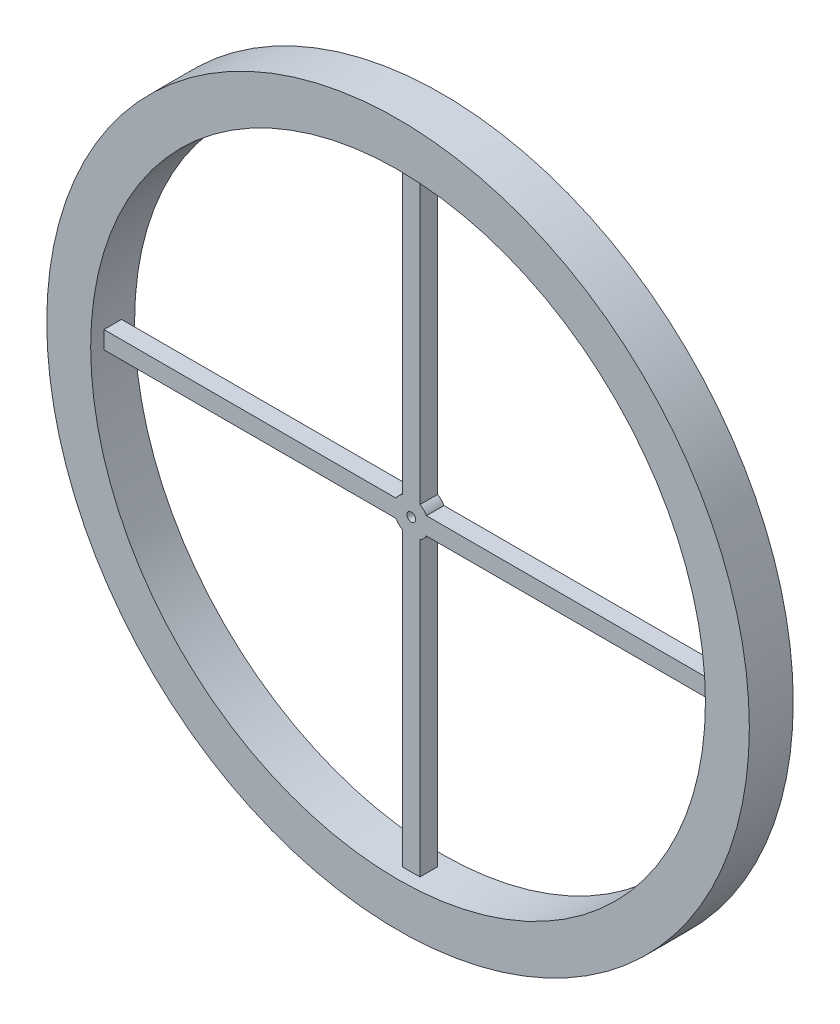
ISO-10303-21;
HEADER;
FILE_DESCRIPTION(('STEP AP214'),'2;1');
FILE_NAME('part.step','',(''),(''),'','','');
FILE_SCHEMA(('AUTOMOTIVE_DESIGN { 1 0 10303 214 1 1 1 1 }'));
ENDSEC;
DATA;
#1=APPLICATION_CONTEXT('core data for automotive mechanical design processes');
#2=APPLICATION_PROTOCOL_DEFINITION('international standard','automotive_design',2000,#1);
#3=PRODUCT_CONTEXT('',#1,'mechanical');
#4=PRODUCT('Part','Part','',(#3));
#5=PRODUCT_RELATED_PRODUCT_CATEGORY('part','',(#4));
#6=PRODUCT_DEFINITION_FORMATION('','',#4);
#7=PRODUCT_DEFINITION_CONTEXT('part definition',#1,'design');
#8=PRODUCT_DEFINITION('design','',#6,#7);
#9=PRODUCT_DEFINITION_SHAPE('','',#8);
#10=(LENGTH_UNIT() NAMED_UNIT(*) SI_UNIT(.MILLI.,.METRE.));
#11=(NAMED_UNIT(*) PLANE_ANGLE_UNIT() SI_UNIT($,.RADIAN.));
#12=(NAMED_UNIT(*) SI_UNIT($,.STERADIAN.) SOLID_ANGLE_UNIT());
#13=UNCERTAINTY_MEASURE_WITH_UNIT(LENGTH_MEASURE(1.E-05),#10,'distance_accuracy_value','');
#14=(GEOMETRIC_REPRESENTATION_CONTEXT(3) GLOBAL_UNCERTAINTY_ASSIGNED_CONTEXT((#13)) GLOBAL_UNIT_ASSIGNED_CONTEXT((#10,
#11,#12)) REPRESENTATION_CONTEXT('',''));
#15=CARTESIAN_POINT('',(0.,0.,0.));
#16=DIRECTION('',(0.,0.,1.));
#17=DIRECTION('',(1.,0.,0.));
#18=AXIS2_PLACEMENT_3D('',#15,#16,#17);
#19=CARTESIAN_POINT('',(0.,0.,1.));
#20=DIRECTION('',(0.,0.,1.));
#21=DIRECTION('',(1.,0.,0.));
#22=AXIS2_PLACEMENT_3D('',#19,#20,#21);
#23=PLANE('',#22);
#24=CARTESIAN_POINT('',(0.,0.,1.));
#25=DIRECTION('',(0.,0.,-1.));
#26=DIRECTION('',(1.,0.,0.));
#27=AXIS2_PLACEMENT_3D('',#24,#25,#26);
#28=CIRCLE('',#27,0.5);
#29=CARTESIAN_POINT('',(0.5,0.,1.));
#30=VERTEX_POINT('',#29);
#31=EDGE_CURVE('E11',#30,#30,#28,.T.);
#32=ORIENTED_EDGE('',*,*,#31,.T.);
#33=EDGE_LOOP('',(#32));
#34=FACE_BOUND('',#33,.T.);
#35=CARTESIAN_POINT('',(0.,0.,1.));
#36=DIRECTION('',(0.,0.,1.));
#37=DIRECTION('',(1.,0.,0.));
#38=AXIS2_PLACEMENT_3D('',#35,#36,#37);
#39=CIRCLE('',#38,35.);
#40=CARTESIAN_POINT('',(0.999999999999999,-34.9857113690718,1.));
#41=VERTEX_POINT('',#40);
#42=CARTESIAN_POINT('',(-0.999999999999874,-34.9857113690718,1.));
#43=VERTEX_POINT('',#42);
#44=EDGE_CURVE('E314',#41,#43,#39,.F.);
#45=ORIENTED_EDGE('',*,*,#44,.F.);
#46=DIRECTION('',(0.,-1.,0.));
#47=VECTOR('',#46,1.);
#48=CARTESIAN_POINT('',(0.999999999999999,-34.9857113690718,1.));
#49=LINE('',#48,#47);
#50=CARTESIAN_POINT('',(0.999999999999995,-1.73205080756888,1.));
#51=VERTEX_POINT('',#50);
#52=EDGE_CURVE('E208',#51,#41,#49,.T.);
#53=ORIENTED_EDGE('',*,*,#52,.F.);
#54=CARTESIAN_POINT('',(0.,0.,1.));
#55=DIRECTION('',(0.,0.,-1.));
#56=DIRECTION('',(-1.,0.,0.));
#57=AXIS2_PLACEMENT_3D('',#54,#55,#56);
#58=CIRCLE('',#57,2.);
#59=CARTESIAN_POINT('',(1.73205080756888,-1.,1.));
#60=VERTEX_POINT('',#59);
#61=EDGE_CURVE('E204',#60,#51,#58,.T.);
#62=ORIENTED_EDGE('',*,*,#61,.F.);
#63=DIRECTION('',(-1.,0.,0.));
#64=VECTOR('',#63,1.);
#65=CARTESIAN_POINT('',(1.73205080756888,-1.,1.));
#66=LINE('',#65,#64);
#67=CARTESIAN_POINT('',(34.9857113690718,-0.999999999999996,1.));
#68=VERTEX_POINT('',#67);
#69=EDGE_CURVE('E202',#68,#60,#66,.T.);
#70=ORIENTED_EDGE('',*,*,#69,.F.);
#71=CARTESIAN_POINT('',(34.9857113690718,1.00000000000037,1.));
#72=VERTEX_POINT('',#71);
#73=EDGE_CURVE('E167',#72,#68,#39,.F.);
#74=ORIENTED_EDGE('',*,*,#73,.F.);
#75=DIRECTION('',(1.,0.,0.));
#76=VECTOR('',#75,1.);
#77=CARTESIAN_POINT('',(34.9857113690718,1.00000000000037,1.));
#78=LINE('',#77,#76);
#79=CARTESIAN_POINT('',(1.73205080756887,1.00000000000001,1.));
#80=VERTEX_POINT('',#79);
#81=EDGE_CURVE('E179',#80,#72,#78,.T.);
#82=ORIENTED_EDGE('',*,*,#81,.F.);
#83=CARTESIAN_POINT('',(0.,0.,1.));
#84=DIRECTION('',(0.,0.,-1.));
#85=DIRECTION('',(0.,-1.,0.));
#86=AXIS2_PLACEMENT_3D('',#83,#84,#85);
#87=CIRCLE('',#86,2.);
#88=CARTESIAN_POINT('',(0.999999999999982,1.73205080756889,1.));
#89=VERTEX_POINT('',#88);
#90=EDGE_CURVE('E189',#89,#80,#87,.T.);
#91=ORIENTED_EDGE('',*,*,#90,.F.);
#92=DIRECTION('',(0.,-1.,0.));
#93=VECTOR('',#92,1.);
#94=CARTESIAN_POINT('',(0.999999999999982,1.73205080756889,1.));
#95=LINE('',#94,#93);
#96=CARTESIAN_POINT('',(0.99999999999963,34.9857113690718,1.));
#97=VERTEX_POINT('',#96);
#98=EDGE_CURVE('E187',#97,#89,#95,.T.);
#99=ORIENTED_EDGE('',*,*,#98,.F.);
#100=CARTESIAN_POINT('',(-0.999999999999999,34.9857113690718,1.));
#101=VERTEX_POINT('',#100);
#102=EDGE_CURVE('E57',#101,#97,#39,.F.);
#103=ORIENTED_EDGE('',*,*,#102,.F.);
#104=DIRECTION('',(0.,1.,0.));
#105=VECTOR('',#104,1.);
#106=CARTESIAN_POINT('',(-0.999999999999999,34.9857113690718,1.));
#107=LINE('',#106,#105);
#108=CARTESIAN_POINT('',(-0.999999999999995,1.73205080756888,1.));
#109=VERTEX_POINT('',#108);
#110=EDGE_CURVE('E257',#109,#101,#107,.T.);
#111=ORIENTED_EDGE('',*,*,#110,.F.);
#112=CARTESIAN_POINT('',(0.,0.,1.));
#113=DIRECTION('',(0.,0.,-1.));
#114=DIRECTION('',(1.,0.,0.));
#115=AXIS2_PLACEMENT_3D('',#112,#113,#114);
#116=CIRCLE('',#115,2.);
#117=CARTESIAN_POINT('',(-1.73205080756888,1.,1.));
#118=VERTEX_POINT('',#117);
#119=EDGE_CURVE('E254',#118,#109,#116,.T.);
#120=ORIENTED_EDGE('',*,*,#119,.F.);
#121=DIRECTION('',(1.,0.,0.));
#122=VECTOR('',#121,1.);
#123=CARTESIAN_POINT('',(-1.73205080756888,1.,1.));
#124=LINE('',#123,#122);
#125=CARTESIAN_POINT('',(-34.9857113690718,0.999999999999996,1.));
#126=VERTEX_POINT('',#125);
#127=EDGE_CURVE('E252',#126,#118,#124,.T.);
#128=ORIENTED_EDGE('',*,*,#127,.F.);
#129=CARTESIAN_POINT('',(-34.9857113690718,-1.00000000000012,1.));
#130=VERTEX_POINT('',#129);
#131=EDGE_CURVE('E319',#130,#126,#39,.F.);
#132=ORIENTED_EDGE('',*,*,#131,.F.);
#133=DIRECTION('',(-1.,0.,0.));
#134=VECTOR('',#133,1.);
#135=CARTESIAN_POINT('',(-34.9857113690718,-1.00000000000012,1.));
#136=LINE('',#135,#134);
#137=CARTESIAN_POINT('',(-1.73205080756888,-1.,1.));
#138=VERTEX_POINT('',#137);
#139=EDGE_CURVE('E231',#138,#130,#136,.T.);
#140=ORIENTED_EDGE('',*,*,#139,.F.);
#141=CARTESIAN_POINT('',(0.,0.,1.));
#142=DIRECTION('',(0.,0.,-1.));
#143=DIRECTION('',(0.,1.,0.));
#144=AXIS2_PLACEMENT_3D('',#141,#142,#143);
#145=CIRCLE('',#144,2.);
#146=CARTESIAN_POINT('',(-0.999999999999994,-1.73205080756888,1.));
#147=VERTEX_POINT('',#146);
#148=EDGE_CURVE('E227',#147,#138,#145,.T.);
#149=ORIENTED_EDGE('',*,*,#148,.F.);
#150=DIRECTION('',(0.,1.,0.));
#151=VECTOR('',#150,1.);
#152=CARTESIAN_POINT('',(-0.999999999999994,-1.73205080756888,1.));
#153=LINE('',#152,#151);
#154=EDGE_CURVE('E225',#43,#147,#153,.T.);
#155=ORIENTED_EDGE('',*,*,#154,.F.);
#156=EDGE_LOOP('',(#45,#53,#62,#70,#74,#82,#91,#99,#103,#111,#120,#128,#132,#140,#149,#155));
#157=FACE_BOUND('',#156,.T.);
#158=ADVANCED_FACE('F33',(#34,#157),#23,.T.);
#159=CARTESIAN_POINT('',(0.,0.,-1.));
#160=DIRECTION('',(0.,0.,1.));
#161=DIRECTION('',(1.,0.,0.));
#162=AXIS2_PLACEMENT_3D('',#159,#160,#161);
#163=PLANE('',#162);
#164=CARTESIAN_POINT('',(0.,0.,-1.));
#165=DIRECTION('',(0.,0.,-1.));
#166=DIRECTION('',(1.,0.,0.));
#167=AXIS2_PLACEMENT_3D('',#164,#165,#166);
#168=CIRCLE('',#167,0.5);
#169=CARTESIAN_POINT('',(0.5,0.,-1.));
#170=VERTEX_POINT('',#169);
#171=EDGE_CURVE('E37',#170,#170,#168,.T.);
#172=ORIENTED_EDGE('',*,*,#171,.F.);
#173=EDGE_LOOP('',(#172));
#174=FACE_BOUND('',#173,.T.);
#175=DIRECTION('',(0.,-1.,0.));
#176=VECTOR('',#175,1.);
#177=CARTESIAN_POINT('',(0.999999999999999,-34.9857113690718,-1.));
#178=LINE('',#177,#176);
#179=CARTESIAN_POINT('',(0.999999999999995,-1.73205080756888,-1.));
#180=VERTEX_POINT('',#179);
#181=CARTESIAN_POINT('',(0.999999999999999,-34.9857113690718,-1.));
#182=VERTEX_POINT('',#181);
#183=EDGE_CURVE('E205',#180,#182,#178,.T.);
#184=ORIENTED_EDGE('',*,*,#183,.T.);
#185=CARTESIAN_POINT('',(0.,0.,-1.));
#186=DIRECTION('',(0.,0.,1.));
#187=DIRECTION('',(1.,0.,0.));
#188=AXIS2_PLACEMENT_3D('',#185,#186,#187);
#189=CIRCLE('',#188,35.);
#190=CARTESIAN_POINT('',(-0.999999999999874,-34.9857113690718,-1.));
#191=VERTEX_POINT('',#190);
#192=EDGE_CURVE('E171',#182,#191,#189,.F.);
#193=ORIENTED_EDGE('',*,*,#192,.T.);
#194=DIRECTION('',(0.,1.,0.));
#195=VECTOR('',#194,1.);
#196=CARTESIAN_POINT('',(-0.999999999999994,-1.73205080756888,-1.));
#197=LINE('',#196,#195);
#198=CARTESIAN_POINT('',(-0.999999999999994,-1.73205080756888,-1.));
#199=VERTEX_POINT('',#198);
#200=EDGE_CURVE('E224',#191,#199,#197,.T.);
#201=ORIENTED_EDGE('',*,*,#200,.T.);
#202=CARTESIAN_POINT('',(0.,0.,-1.));
#203=DIRECTION('',(0.,0.,-1.));
#204=DIRECTION('',(0.,1.,0.));
#205=AXIS2_PLACEMENT_3D('',#202,#203,#204);
#206=CIRCLE('',#205,2.);
#207=CARTESIAN_POINT('',(-1.73205080756888,-1.,-1.));
#208=VERTEX_POINT('',#207);
#209=EDGE_CURVE('E237',#199,#208,#206,.T.);
#210=ORIENTED_EDGE('',*,*,#209,.T.);
#211=DIRECTION('',(-1.,0.,0.));
#212=VECTOR('',#211,1.);
#213=CARTESIAN_POINT('',(-34.9857113690718,-1.00000000000012,-1.));
#214=LINE('',#213,#212);
#215=CARTESIAN_POINT('',(-34.9857113690718,-1.00000000000012,-1.));
#216=VERTEX_POINT('',#215);
#217=EDGE_CURVE('E228',#208,#216,#214,.T.);
#218=ORIENTED_EDGE('',*,*,#217,.T.);
#219=CARTESIAN_POINT('',(-34.9857113690718,0.999999999999996,-1.));
#220=VERTEX_POINT('',#219);
#221=EDGE_CURVE('E322',#216,#220,#189,.F.);
#222=ORIENTED_EDGE('',*,*,#221,.T.);
#223=DIRECTION('',(1.,0.,0.));
#224=VECTOR('',#223,1.);
#225=CARTESIAN_POINT('',(-1.73205080756888,1.,-1.));
#226=LINE('',#225,#224);
#227=CARTESIAN_POINT('',(-1.73205080756888,1.,-1.));
#228=VERTEX_POINT('',#227);
#229=EDGE_CURVE('E251',#220,#228,#226,.T.);
#230=ORIENTED_EDGE('',*,*,#229,.T.);
#231=CARTESIAN_POINT('',(0.,0.,-1.));
#232=DIRECTION('',(0.,0.,-1.));
#233=DIRECTION('',(1.,0.,0.));
#234=AXIS2_PLACEMENT_3D('',#231,#232,#233);
#235=CIRCLE('',#234,2.);
#236=CARTESIAN_POINT('',(-0.999999999999995,1.73205080756888,-1.));
#237=VERTEX_POINT('',#236);
#238=EDGE_CURVE('E262',#228,#237,#235,.T.);
#239=ORIENTED_EDGE('',*,*,#238,.T.);
#240=DIRECTION('',(0.,1.,0.));
#241=VECTOR('',#240,1.);
#242=CARTESIAN_POINT('',(-0.999999999999999,34.9857113690718,-1.));
#243=LINE('',#242,#241);
#244=CARTESIAN_POINT('',(-0.999999999999999,34.9857113690718,-1.));
#245=VERTEX_POINT('',#244);
#246=EDGE_CURVE('E255',#237,#245,#243,.T.);
#247=ORIENTED_EDGE('',*,*,#246,.T.);
#248=CARTESIAN_POINT('',(0.99999999999963,34.9857113690718,-1.));
#249=VERTEX_POINT('',#248);
#250=EDGE_CURVE('E170',#245,#249,#189,.F.);
#251=ORIENTED_EDGE('',*,*,#250,.T.);
#252=DIRECTION('',(0.,-1.,0.));
#253=VECTOR('',#252,1.);
#254=CARTESIAN_POINT('',(0.999999999999982,1.73205080756889,-1.));
#255=LINE('',#254,#253);
#256=CARTESIAN_POINT('',(0.999999999999982,1.73205080756889,-1.));
#257=VERTEX_POINT('',#256);
#258=EDGE_CURVE('E191',#249,#257,#255,.T.);
#259=ORIENTED_EDGE('',*,*,#258,.T.);
#260=CARTESIAN_POINT('',(0.,0.,-1.));
#261=DIRECTION('',(0.,0.,-1.));
#262=DIRECTION('',(0.,-1.,0.));
#263=AXIS2_PLACEMENT_3D('',#260,#261,#262);
#264=CIRCLE('',#263,2.);
#265=CARTESIAN_POINT('',(1.73205080756887,1.00000000000001,-1.));
#266=VERTEX_POINT('',#265);
#267=EDGE_CURVE('E186',#257,#266,#264,.T.);
#268=ORIENTED_EDGE('',*,*,#267,.T.);
#269=DIRECTION('',(1.,0.,0.));
#270=VECTOR('',#269,1.);
#271=CARTESIAN_POINT('',(34.9857113690718,1.00000000000037,-1.));
#272=LINE('',#271,#270);
#273=CARTESIAN_POINT('',(34.9857113690718,1.00000000000037,-1.));
#274=VERTEX_POINT('',#273);
#275=EDGE_CURVE('E176',#266,#274,#272,.T.);
#276=ORIENTED_EDGE('',*,*,#275,.T.);
#277=CARTESIAN_POINT('',(34.9857113690718,-0.999999999999996,-1.));
#278=VERTEX_POINT('',#277);
#279=EDGE_CURVE('E155',#274,#278,#189,.F.);
#280=ORIENTED_EDGE('',*,*,#279,.T.);
#281=DIRECTION('',(-1.,0.,0.));
#282=VECTOR('',#281,1.);
#283=CARTESIAN_POINT('',(1.73205080756888,-1.,-1.));
#284=LINE('',#283,#282);
#285=CARTESIAN_POINT('',(1.73205080756888,-1.,-1.));
#286=VERTEX_POINT('',#285);
#287=EDGE_CURVE('E201',#278,#286,#284,.T.);
#288=ORIENTED_EDGE('',*,*,#287,.T.);
#289=CARTESIAN_POINT('',(0.,0.,-1.));
#290=DIRECTION('',(0.,0.,-1.));
#291=DIRECTION('',(-1.,0.,0.));
#292=AXIS2_PLACEMENT_3D('',#289,#290,#291);
#293=CIRCLE('',#292,2.);
#294=EDGE_CURVE('E213',#286,#180,#293,.T.);
#295=ORIENTED_EDGE('',*,*,#294,.T.);
#296=EDGE_LOOP('',(#184,#193,#201,#210,#218,#222,#230,#239,#247,#251,#259,#268,#276,#280,#288,#295));
#297=FACE_BOUND('',#296,.T.);
#298=ADVANCED_FACE('F183',(#174,#297),#163,.F.);
#299=CARTESIAN_POINT('',(0.,0.,1.));
#300=DIRECTION('',(0.,0.,-1.));
#301=DIRECTION('',(-1.,0.,0.));
#302=AXIS2_PLACEMENT_3D('',#299,#300,#301);
#303=CYLINDRICAL_SURFACE('',#302,0.5);
#304=ORIENTED_EDGE('',*,*,#171,.T.);
#305=EDGE_LOOP('',(#304));
#306=FACE_BOUND('',#305,.T.);
#307=ORIENTED_EDGE('',*,*,#31,.F.);
#308=EDGE_LOOP('',(#307));
#309=FACE_BOUND('',#308,.T.);
#310=ADVANCED_FACE('F35',(#306,#309),#303,.F.);
#311=CARTESIAN_POINT('',(0.,0.,1.));
#312=DIRECTION('',(0.,0.,-1.));
#313=DIRECTION('',(-1.,0.,0.));
#314=AXIS2_PLACEMENT_3D('',#311,#312,#313);
#315=CYLINDRICAL_SURFACE('',#314,35.);
#316=ORIENTED_EDGE('',*,*,#73,.T.);
#317=DIRECTION('',(0.,0.,-1.));
#318=VECTOR('',#317,1.);
#319=CARTESIAN_POINT('',(34.9857113690718,-0.999999999999996,1.));
#320=LINE('',#319,#318);
#321=EDGE_CURVE('E162',#68,#278,#320,.T.);
#322=ORIENTED_EDGE('',*,*,#321,.T.);
#323=ORIENTED_EDGE('',*,*,#279,.F.);
#324=DIRECTION('',(0.,0.,-1.));
#325=VECTOR('',#324,1.);
#326=CARTESIAN_POINT('',(34.9857113690718,1.00000000000037,1.));
#327=LINE('',#326,#325);
#328=EDGE_CURVE('E160',#72,#274,#327,.T.);
#329=ORIENTED_EDGE('',*,*,#328,.F.);
#330=EDGE_LOOP('',(#316,#322,#323,#329));
#331=FACE_BOUND('',#330,.T.);
#332=ORIENTED_EDGE('',*,*,#44,.T.);
#333=DIRECTION('',(0.,0.,-1.));
#334=VECTOR('',#333,1.);
#335=CARTESIAN_POINT('',(-0.999999999999874,-34.9857113690718,1.));
#336=LINE('',#335,#334);
#337=EDGE_CURVE('E248',#43,#191,#336,.T.);
#338=ORIENTED_EDGE('',*,*,#337,.T.);
#339=ORIENTED_EDGE('',*,*,#192,.F.);
#340=DIRECTION('',(0.,0.,-1.));
#341=VECTOR('',#340,1.);
#342=CARTESIAN_POINT('',(0.999999999999999,-34.9857113690718,1.));
#343=LINE('',#342,#341);
#344=EDGE_CURVE('E211',#41,#182,#343,.T.);
#345=ORIENTED_EDGE('',*,*,#344,.F.);
#346=EDGE_LOOP('',(#332,#338,#339,#345));
#347=FACE_BOUND('',#346,.T.);
#348=ORIENTED_EDGE('',*,*,#131,.T.);
#349=DIRECTION('',(0.,0.,-1.));
#350=VECTOR('',#349,1.);
#351=CARTESIAN_POINT('',(-34.9857113690718,0.999999999999996,1.));
#352=LINE('',#351,#350);
#353=EDGE_CURVE('E73',#126,#220,#352,.T.);
#354=ORIENTED_EDGE('',*,*,#353,.T.);
#355=ORIENTED_EDGE('',*,*,#221,.F.);
#356=DIRECTION('',(0.,0.,-1.));
#357=VECTOR('',#356,1.);
#358=CARTESIAN_POINT('',(-34.9857113690718,-1.00000000000012,1.));
#359=LINE('',#358,#357);
#360=EDGE_CURVE('E234',#130,#216,#359,.T.);
#361=ORIENTED_EDGE('',*,*,#360,.F.);
#362=EDGE_LOOP('',(#348,#354,#355,#361));
#363=FACE_BOUND('',#362,.T.);
#364=DIRECTION('',(0.,0.,-1.));
#365=VECTOR('',#364,1.);
#366=CARTESIAN_POINT('',(-0.999999999999999,34.9857113690718,1.));
#367=LINE('',#366,#365);
#368=EDGE_CURVE('E259',#101,#245,#367,.T.);
#369=ORIENTED_EDGE('',*,*,#368,.F.);
#370=ORIENTED_EDGE('',*,*,#102,.T.);
#371=DIRECTION('',(0.,0.,-1.));
#372=VECTOR('',#371,1.);
#373=CARTESIAN_POINT('',(0.99999999999963,34.9857113690718,1.));
#374=LINE('',#373,#372);
#375=EDGE_CURVE('E198',#97,#249,#374,.T.);
#376=ORIENTED_EDGE('',*,*,#375,.T.);
#377=ORIENTED_EDGE('',*,*,#250,.F.);
#378=EDGE_LOOP('',(#369,#370,#376,#377));
#379=FACE_BOUND('',#378,.T.);
#380=CARTESIAN_POINT('',(0.,0.,-2.5));
#381=DIRECTION('',(0.,0.,1.));
#382=DIRECTION('',(1.,0.,0.));
#383=AXIS2_PLACEMENT_3D('',#380,#381,#382);
#384=CIRCLE('',#383,35.);
#385=CARTESIAN_POINT('',(35.,0.,-2.5));
#386=VERTEX_POINT('',#385);
#387=EDGE_CURVE('E311',#386,#386,#384,.T.);
#388=ORIENTED_EDGE('',*,*,#387,.F.);
#389=EDGE_LOOP('',(#388));
#390=FACE_BOUND('',#389,.T.);
#391=CARTESIAN_POINT('',(0.,0.,2.5));
#392=DIRECTION('',(0.,0.,1.));
#393=DIRECTION('',(1.,0.,0.));
#394=AXIS2_PLACEMENT_3D('',#391,#392,#393);
#395=CIRCLE('',#394,35.);
#396=CARTESIAN_POINT('',(35.,0.,2.5));
#397=VERTEX_POINT('',#396);
#398=EDGE_CURVE('E308',#397,#397,#395,.T.);
#399=ORIENTED_EDGE('',*,*,#398,.T.);
#400=EDGE_LOOP('',(#399));
#401=FACE_BOUND('',#400,.T.);
#402=ADVANCED_FACE('F158',(#331,#347,#363,#379,#390,#401),#315,.F.);
#403=CARTESIAN_POINT('',(-1.73205080756888,1.,1.));
#404=DIRECTION('',(0.,1.,0.));
#405=DIRECTION('',(-1.,0.,0.));
#406=AXIS2_PLACEMENT_3D('',#403,#404,#405);
#407=PLANE('',#406);
#408=ORIENTED_EDGE('',*,*,#229,.F.);
#409=ORIENTED_EDGE('',*,*,#353,.F.);
#410=ORIENTED_EDGE('',*,*,#127,.T.);
#411=DIRECTION('',(0.,0.,-1.));
#412=VECTOR('',#411,1.);
#413=CARTESIAN_POINT('',(-1.73205080756888,1.,1.));
#414=LINE('',#413,#412);
#415=EDGE_CURVE('E270',#118,#228,#414,.T.);
#416=ORIENTED_EDGE('',*,*,#415,.T.);
#417=EDGE_LOOP('',(#408,#409,#410,#416));
#418=FACE_BOUND('',#417,.T.);
#419=ADVANCED_FACE('F334',(#418),#407,.T.);
#420=CARTESIAN_POINT('',(0.,0.,1.));
#421=DIRECTION('',(0.,0.,-1.));
#422=DIRECTION('',(-1.,0.,0.));
#423=AXIS2_PLACEMENT_3D('',#420,#421,#422);
#424=CYLINDRICAL_SURFACE('',#423,2.);
#425=ORIENTED_EDGE('',*,*,#238,.F.);
#426=ORIENTED_EDGE('',*,*,#415,.F.);
#427=ORIENTED_EDGE('',*,*,#119,.T.);
#428=DIRECTION('',(0.,0.,-1.));
#429=VECTOR('',#428,1.);
#430=CARTESIAN_POINT('',(-0.999999999999995,1.73205080756888,1.));
#431=LINE('',#430,#429);
#432=EDGE_CURVE('E48',#109,#237,#431,.T.);
#433=ORIENTED_EDGE('',*,*,#432,.T.);
#434=EDGE_LOOP('',(#425,#426,#427,#433));
#435=FACE_BOUND('',#434,.T.);
#436=ADVANCED_FACE('F345',(#435),#424,.T.);
#437=CARTESIAN_POINT('',(-0.999999999999999,34.9857113690718,1.));
#438=DIRECTION('',(-1.,0.,0.));
#439=DIRECTION('',(0.,-1.,0.));
#440=AXIS2_PLACEMENT_3D('',#437,#438,#439);
#441=PLANE('',#440);
#442=ORIENTED_EDGE('',*,*,#246,.F.);
#443=ORIENTED_EDGE('',*,*,#432,.F.);
#444=ORIENTED_EDGE('',*,*,#110,.T.);
#445=ORIENTED_EDGE('',*,*,#368,.T.);
#446=EDGE_LOOP('',(#442,#443,#444,#445));
#447=FACE_BOUND('',#446,.T.);
#448=ADVANCED_FACE('F343',(#447),#441,.T.);
#449=CARTESIAN_POINT('',(-0.999999999999994,-1.73205080756888,1.));
#450=DIRECTION('',(-1.,0.,0.));
#451=DIRECTION('',(0.,-1.,0.));
#452=AXIS2_PLACEMENT_3D('',#449,#450,#451);
#453=PLANE('',#452);
#454=ORIENTED_EDGE('',*,*,#200,.F.);
#455=ORIENTED_EDGE('',*,*,#337,.F.);
#456=ORIENTED_EDGE('',*,*,#154,.T.);
#457=DIRECTION('',(0.,0.,-1.));
#458=VECTOR('',#457,1.);
#459=CARTESIAN_POINT('',(-0.999999999999994,-1.73205080756888,1.));
#460=LINE('',#459,#458);
#461=EDGE_CURVE('E246',#147,#199,#460,.T.);
#462=ORIENTED_EDGE('',*,*,#461,.T.);
#463=EDGE_LOOP('',(#454,#455,#456,#462));
#464=FACE_BOUND('',#463,.T.);
#465=ADVANCED_FACE('F329',(#464),#453,.T.);
#466=CARTESIAN_POINT('',(0.,0.,1.));
#467=DIRECTION('',(0.,0.,-1.));
#468=DIRECTION('',(-1.,0.,0.));
#469=AXIS2_PLACEMENT_3D('',#466,#467,#468);
#470=CYLINDRICAL_SURFACE('',#469,2.);
#471=ORIENTED_EDGE('',*,*,#209,.F.);
#472=ORIENTED_EDGE('',*,*,#461,.F.);
#473=ORIENTED_EDGE('',*,*,#148,.T.);
#474=DIRECTION('',(0.,0.,-1.));
#475=VECTOR('',#474,1.);
#476=CARTESIAN_POINT('',(-1.73205080756888,-1.,1.));
#477=LINE('',#476,#475);
#478=EDGE_CURVE('E244',#138,#208,#477,.T.);
#479=ORIENTED_EDGE('',*,*,#478,.T.);
#480=EDGE_LOOP('',(#471,#472,#473,#479));
#481=FACE_BOUND('',#480,.T.);
#482=ADVANCED_FACE('F359',(#481),#470,.T.);
#483=CARTESIAN_POINT('',(-34.9857113690718,-1.00000000000012,1.));
#484=DIRECTION('',(0.,-1.,0.));
#485=DIRECTION('',(1.,0.,0.));
#486=AXIS2_PLACEMENT_3D('',#483,#484,#485);
#487=PLANE('',#486);
#488=ORIENTED_EDGE('',*,*,#217,.F.);
#489=ORIENTED_EDGE('',*,*,#478,.F.);
#490=ORIENTED_EDGE('',*,*,#139,.T.);
#491=ORIENTED_EDGE('',*,*,#360,.T.);
#492=EDGE_LOOP('',(#488,#489,#490,#491));
#493=FACE_BOUND('',#492,.T.);
#494=ADVANCED_FACE('F362',(#493),#487,.T.);
#495=CARTESIAN_POINT('',(1.73205080756888,-1.,1.));
#496=DIRECTION('',(0.,-1.,0.));
#497=DIRECTION('',(1.,0.,0.));
#498=AXIS2_PLACEMENT_3D('',#495,#496,#497);
#499=PLANE('',#498);
#500=ORIENTED_EDGE('',*,*,#287,.F.);
#501=ORIENTED_EDGE('',*,*,#321,.F.);
#502=ORIENTED_EDGE('',*,*,#69,.T.);
#503=DIRECTION('',(0.,0.,-1.));
#504=VECTOR('',#503,1.);
#505=CARTESIAN_POINT('',(1.73205080756888,-1.,1.));
#506=LINE('',#505,#504);
#507=EDGE_CURVE('E221',#60,#286,#506,.T.);
#508=ORIENTED_EDGE('',*,*,#507,.T.);
#509=EDGE_LOOP('',(#500,#501,#502,#508));
#510=FACE_BOUND('',#509,.T.);
#511=ADVANCED_FACE('F366',(#510),#499,.T.);
#512=CARTESIAN_POINT('',(0.,0.,1.));
#513=DIRECTION('',(0.,0.,-1.));
#514=DIRECTION('',(-1.,0.,0.));
#515=AXIS2_PLACEMENT_3D('',#512,#513,#514);
#516=CYLINDRICAL_SURFACE('',#515,2.);
#517=ORIENTED_EDGE('',*,*,#294,.F.);
#518=ORIENTED_EDGE('',*,*,#507,.F.);
#519=ORIENTED_EDGE('',*,*,#61,.T.);
#520=DIRECTION('',(0.,0.,-1.));
#521=VECTOR('',#520,1.);
#522=CARTESIAN_POINT('',(0.999999999999995,-1.73205080756888,1.));
#523=LINE('',#522,#521);
#524=EDGE_CURVE('E219',#51,#180,#523,.T.);
#525=ORIENTED_EDGE('',*,*,#524,.T.);
#526=EDGE_LOOP('',(#517,#518,#519,#525));
#527=FACE_BOUND('',#526,.T.);
#528=ADVANCED_FACE('F370',(#527),#516,.T.);
#529=CARTESIAN_POINT('',(0.999999999999999,-34.9857113690718,1.));
#530=DIRECTION('',(1.,0.,0.));
#531=DIRECTION('',(0.,1.,0.));
#532=AXIS2_PLACEMENT_3D('',#529,#530,#531);
#533=PLANE('',#532);
#534=ORIENTED_EDGE('',*,*,#183,.F.);
#535=ORIENTED_EDGE('',*,*,#524,.F.);
#536=ORIENTED_EDGE('',*,*,#52,.T.);
#537=ORIENTED_EDGE('',*,*,#344,.T.);
#538=EDGE_LOOP('',(#534,#535,#536,#537));
#539=FACE_BOUND('',#538,.T.);
#540=ADVANCED_FACE('F374',(#539),#533,.T.);
#541=CARTESIAN_POINT('',(0.999999999999982,1.73205080756889,1.));
#542=DIRECTION('',(1.,0.,0.));
#543=DIRECTION('',(0.,1.,0.));
#544=AXIS2_PLACEMENT_3D('',#541,#542,#543);
#545=PLANE('',#544);
#546=ORIENTED_EDGE('',*,*,#258,.F.);
#547=ORIENTED_EDGE('',*,*,#375,.F.);
#548=ORIENTED_EDGE('',*,*,#98,.T.);
#549=DIRECTION('',(0.,0.,-1.));
#550=VECTOR('',#549,1.);
#551=CARTESIAN_POINT('',(0.999999999999982,1.73205080756889,1.));
#552=LINE('',#551,#550);
#553=EDGE_CURVE('E196',#89,#257,#552,.T.);
#554=ORIENTED_EDGE('',*,*,#553,.T.);
#555=EDGE_LOOP('',(#546,#547,#548,#554));
#556=FACE_BOUND('',#555,.T.);
#557=ADVANCED_FACE('F378',(#556),#545,.T.);
#558=CARTESIAN_POINT('',(0.,0.,1.));
#559=DIRECTION('',(0.,0.,-1.));
#560=DIRECTION('',(-1.,0.,0.));
#561=AXIS2_PLACEMENT_3D('',#558,#559,#560);
#562=CYLINDRICAL_SURFACE('',#561,2.);
#563=ORIENTED_EDGE('',*,*,#267,.F.);
#564=ORIENTED_EDGE('',*,*,#553,.F.);
#565=ORIENTED_EDGE('',*,*,#90,.T.);
#566=DIRECTION('',(0.,0.,-1.));
#567=VECTOR('',#566,1.);
#568=CARTESIAN_POINT('',(1.73205080756887,1.00000000000001,1.));
#569=LINE('',#568,#567);
#570=EDGE_CURVE('E180',#80,#266,#569,.T.);
#571=ORIENTED_EDGE('',*,*,#570,.T.);
#572=EDGE_LOOP('',(#563,#564,#565,#571));
#573=FACE_BOUND('',#572,.T.);
#574=ADVANCED_FACE('F382',(#573),#562,.T.);
#575=CARTESIAN_POINT('',(34.9857113690718,1.00000000000037,1.));
#576=DIRECTION('',(0.,1.,0.));
#577=DIRECTION('',(-1.,0.,0.));
#578=AXIS2_PLACEMENT_3D('',#575,#576,#577);
#579=PLANE('',#578);
#580=ORIENTED_EDGE('',*,*,#275,.F.);
#581=ORIENTED_EDGE('',*,*,#570,.F.);
#582=ORIENTED_EDGE('',*,*,#81,.T.);
#583=ORIENTED_EDGE('',*,*,#328,.T.);
#584=EDGE_LOOP('',(#580,#581,#582,#583));
#585=FACE_BOUND('',#584,.T.);
#586=ADVANCED_FACE('F175',(#585),#579,.T.);
#587=CARTESIAN_POINT('',(0.,0.,-2.5));
#588=DIRECTION('',(0.,0.,1.));
#589=DIRECTION('',(1.,0.,0.));
#590=AXIS2_PLACEMENT_3D('',#587,#588,#589);
#591=PLANE('',#590);
#592=CARTESIAN_POINT('',(0.,0.,-2.5));
#593=DIRECTION('',(0.,0.,1.));
#594=DIRECTION('',(1.,0.,0.));
#595=AXIS2_PLACEMENT_3D('',#592,#593,#594);
#596=CIRCLE('',#595,40.);
#597=CARTESIAN_POINT('',(40.,0.,-2.5));
#598=VERTEX_POINT('',#597);
#599=EDGE_CURVE('E304',#598,#598,#596,.T.);
#600=ORIENTED_EDGE('',*,*,#599,.F.);
#601=EDGE_LOOP('',(#600));
#602=FACE_BOUND('',#601,.T.);
#603=ORIENTED_EDGE('',*,*,#387,.T.);
#604=EDGE_LOOP('',(#603));
#605=FACE_BOUND('',#604,.T.);
#606=ADVANCED_FACE('F291',(#602,#605),#591,.F.);
#607=CARTESIAN_POINT('',(0.,0.,1.));
#608=DIRECTION('',(0.,0.,-1.));
#609=DIRECTION('',(-1.,0.,0.));
#610=AXIS2_PLACEMENT_3D('',#607,#608,#609);
#611=CYLINDRICAL_SURFACE('',#610,40.);
#612=ORIENTED_EDGE('',*,*,#599,.T.);
#613=EDGE_LOOP('',(#612));
#614=FACE_BOUND('',#613,.T.);
#615=CARTESIAN_POINT('',(0.,0.,2.5));
#616=DIRECTION('',(0.,0.,1.));
#617=DIRECTION('',(1.,0.,0.));
#618=AXIS2_PLACEMENT_3D('',#615,#616,#617);
#619=CIRCLE('',#618,40.);
#620=CARTESIAN_POINT('',(40.,0.,2.5));
#621=VERTEX_POINT('',#620);
#622=EDGE_CURVE('E168',#621,#621,#619,.T.);
#623=ORIENTED_EDGE('',*,*,#622,.F.);
#624=EDGE_LOOP('',(#623));
#625=FACE_BOUND('',#624,.T.);
#626=ADVANCED_FACE('F288',(#614,#625),#611,.T.);
#627=CARTESIAN_POINT('',(0.,0.,2.5));
#628=DIRECTION('',(0.,0.,1.));
#629=DIRECTION('',(1.,0.,0.));
#630=AXIS2_PLACEMENT_3D('',#627,#628,#629);
#631=PLANE('',#630);
#632=ORIENTED_EDGE('',*,*,#622,.T.);
#633=EDGE_LOOP('',(#632));
#634=FACE_BOUND('',#633,.T.);
#635=ORIENTED_EDGE('',*,*,#398,.F.);
#636=EDGE_LOOP('',(#635));
#637=FACE_BOUND('',#636,.T.);
#638=ADVANCED_FACE('F290',(#634,#637),#631,.T.);
#639=CLOSED_SHELL('',(#158,#298,#310,#402,#419,#436,#448,#465,#482,#494,#511,#528,#540,#557,
#574,#586,#606,#626,#638));
#640=MANIFOLD_SOLID_BREP('B2',#639);
#641=ADVANCED_BREP_SHAPE_REPRESENTATION('',(#18,#640),#14);
#642=SHAPE_DEFINITION_REPRESENTATION(#9,#641);
ENDSEC;
END-ISO-10303-21;
